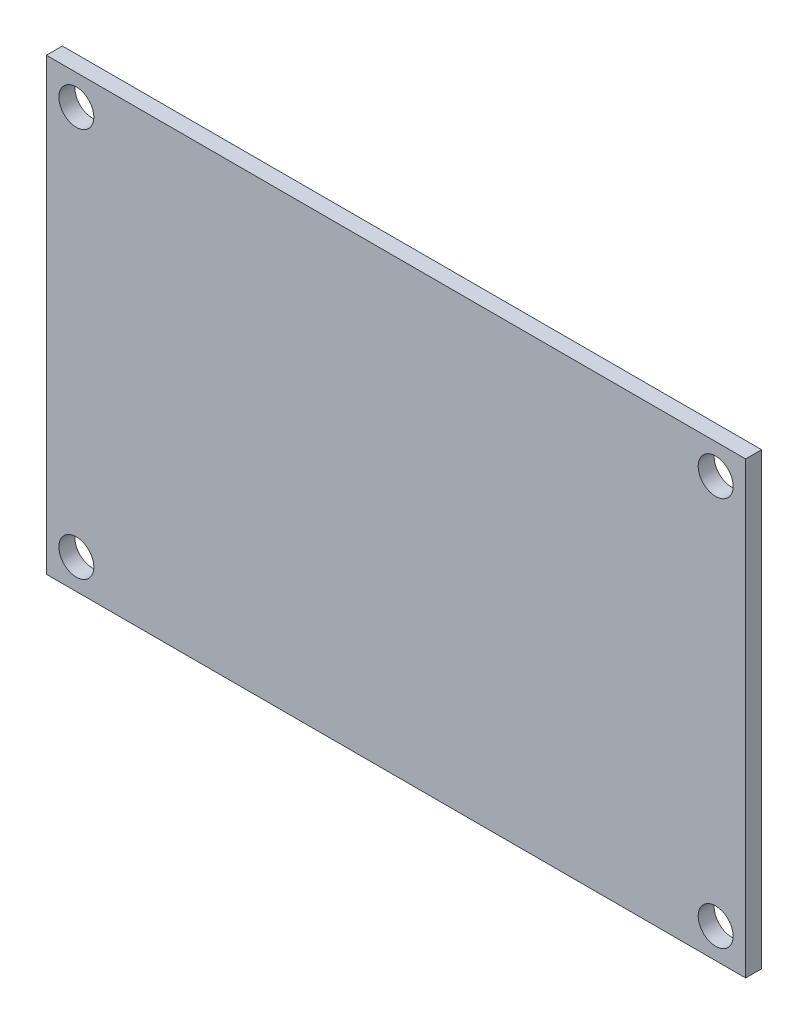
ISO-10303-21;
HEADER;
FILE_DESCRIPTION(('STEP AP214'),'2;1');
FILE_NAME('part.step','',(''),(''),'','','');
FILE_SCHEMA(('AUTOMOTIVE_DESIGN { 1 0 10303 214 1 1 1 1 }'));
ENDSEC;
DATA;
#1=APPLICATION_CONTEXT('core data for automotive mechanical design processes');
#2=APPLICATION_PROTOCOL_DEFINITION('international standard','automotive_design',2000,#1);
#3=PRODUCT_CONTEXT('',#1,'mechanical');
#4=PRODUCT('Part','Part','',(#3));
#5=PRODUCT_RELATED_PRODUCT_CATEGORY('part','',(#4));
#6=PRODUCT_DEFINITION_FORMATION('','',#4);
#7=PRODUCT_DEFINITION_CONTEXT('part definition',#1,'design');
#8=PRODUCT_DEFINITION('design','',#6,#7);
#9=PRODUCT_DEFINITION_SHAPE('','',#8);
#10=(LENGTH_UNIT() NAMED_UNIT(*) SI_UNIT(.MILLI.,.METRE.));
#11=(NAMED_UNIT(*) PLANE_ANGLE_UNIT() SI_UNIT($,.RADIAN.));
#12=(NAMED_UNIT(*) SI_UNIT($,.STERADIAN.) SOLID_ANGLE_UNIT());
#13=UNCERTAINTY_MEASURE_WITH_UNIT(LENGTH_MEASURE(1.E-05),#10,'distance_accuracy_value','');
#14=(GEOMETRIC_REPRESENTATION_CONTEXT(3) GLOBAL_UNCERTAINTY_ASSIGNED_CONTEXT((#13)) GLOBAL_UNIT_ASSIGNED_CONTEXT((#10,
#11,#12)) REPRESENTATION_CONTEXT('',''));
#15=CARTESIAN_POINT('',(0.,0.,0.));
#16=DIRECTION('',(0.,0.,1.));
#17=DIRECTION('',(1.,0.,0.));
#18=AXIS2_PLACEMENT_3D('',#15,#16,#17);
#19=CARTESIAN_POINT('',(0.,0.,1.6));
#20=DIRECTION('',(0.,0.,-1.));
#21=DIRECTION('',(-1.,0.,0.));
#22=AXIS2_PLACEMENT_3D('',#19,#20,#21);
#23=PLANE('',#22);
#24=CARTESIAN_POINT('',(-32.,-19.5,1.6));
#25=DIRECTION('',(0.,0.,-1.));
#26=DIRECTION('',(1.,0.,0.));
#27=AXIS2_PLACEMENT_3D('',#24,#25,#26);
#28=CIRCLE('',#27,1.75);
#29=CARTESIAN_POINT('',(-30.25,-19.5,1.6));
#30=VERTEX_POINT('',#29);
#31=EDGE_CURVE('E118',#30,#30,#28,.T.);
#32=ORIENTED_EDGE('',*,*,#31,.T.);
#33=EDGE_LOOP('',(#32));
#34=FACE_BOUND('',#33,.T.);
#35=CARTESIAN_POINT('',(-32.,19.5,1.6));
#36=DIRECTION('',(0.,0.,1.));
#37=DIRECTION('',(1.,0.,0.));
#38=AXIS2_PLACEMENT_3D('',#35,#36,#37);
#39=CIRCLE('',#38,1.75);
#40=CARTESIAN_POINT('',(-30.25,19.5,1.6));
#41=VERTEX_POINT('',#40);
#42=EDGE_CURVE('E112',#41,#41,#39,.T.);
#43=ORIENTED_EDGE('',*,*,#42,.F.);
#44=EDGE_LOOP('',(#43));
#45=FACE_BOUND('',#44,.T.);
#46=DIRECTION('',(0.,1.,0.));
#47=VECTOR('',#46,1.);
#48=CARTESIAN_POINT('',(35.,-22.5,1.6));
#49=LINE('',#48,#47);
#50=CARTESIAN_POINT('',(35.,-22.5,1.6));
#51=VERTEX_POINT('',#50);
#52=CARTESIAN_POINT('',(35.,22.5,1.6));
#53=VERTEX_POINT('',#52);
#54=EDGE_CURVE('E85',#51,#53,#49,.T.);
#55=ORIENTED_EDGE('',*,*,#54,.T.);
#56=DIRECTION('',(-1.,0.,0.));
#57=VECTOR('',#56,1.);
#58=CARTESIAN_POINT('',(-35.,22.5,1.6));
#59=LINE('',#58,#57);
#60=CARTESIAN_POINT('',(-35.,22.5,1.6));
#61=VERTEX_POINT('',#60);
#62=EDGE_CURVE('E80',#53,#61,#59,.T.);
#63=ORIENTED_EDGE('',*,*,#62,.T.);
#64=DIRECTION('',(0.,-1.,0.));
#65=VECTOR('',#64,1.);
#66=CARTESIAN_POINT('',(-35.,-22.5,1.6));
#67=LINE('',#66,#65);
#68=CARTESIAN_POINT('',(-35.,-22.5,1.6));
#69=VERTEX_POINT('',#68);
#70=EDGE_CURVE('E83',#61,#69,#67,.T.);
#71=ORIENTED_EDGE('',*,*,#70,.T.);
#72=DIRECTION('',(1.,0.,0.));
#73=VECTOR('',#72,1.);
#74=CARTESIAN_POINT('',(-35.,-22.5,1.6));
#75=LINE('',#74,#73);
#76=EDGE_CURVE('E50',#69,#51,#75,.T.);
#77=ORIENTED_EDGE('',*,*,#76,.T.);
#78=EDGE_LOOP('',(#55,#63,#71,#77));
#79=FACE_BOUND('',#78,.T.);
#80=CARTESIAN_POINT('',(32.,-19.5,1.6));
#81=DIRECTION('',(0.,0.,1.));
#82=DIRECTION('',(-1.,0.,0.));
#83=AXIS2_PLACEMENT_3D('',#80,#81,#82);
#84=CIRCLE('',#83,1.75);
#85=CARTESIAN_POINT('',(30.25,-19.5,1.6));
#86=VERTEX_POINT('',#85);
#87=EDGE_CURVE('E124',#86,#86,#84,.T.);
#88=ORIENTED_EDGE('',*,*,#87,.F.);
#89=EDGE_LOOP('',(#88));
#90=FACE_BOUND('',#89,.T.);
#91=CARTESIAN_POINT('',(32.,19.5,1.6));
#92=DIRECTION('',(0.,0.,-1.));
#93=DIRECTION('',(-1.,0.,0.));
#94=AXIS2_PLACEMENT_3D('',#91,#92,#93);
#95=CIRCLE('',#94,1.75);
#96=CARTESIAN_POINT('',(30.25,19.5,1.6));
#97=VERTEX_POINT('',#96);
#98=EDGE_CURVE('E130',#97,#97,#95,.T.);
#99=ORIENTED_EDGE('',*,*,#98,.T.);
#100=EDGE_LOOP('',(#99));
#101=FACE_BOUND('',#100,.T.);
#102=ADVANCED_FACE('F33',(#34,#45,#79,#90,#101),#23,.F.);
#103=CARTESIAN_POINT('',(0.,0.,0.));
#104=DIRECTION('',(0.,0.,-1.));
#105=DIRECTION('',(-1.,0.,0.));
#106=AXIS2_PLACEMENT_3D('',#103,#104,#105);
#107=PLANE('',#106);
#108=CARTESIAN_POINT('',(-32.,-19.5,0.));
#109=DIRECTION('',(0.,0.,-1.));
#110=DIRECTION('',(1.,0.,0.));
#111=AXIS2_PLACEMENT_3D('',#108,#109,#110);
#112=CIRCLE('',#111,1.75);
#113=CARTESIAN_POINT('',(-30.25,-19.5,0.));
#114=VERTEX_POINT('',#113);
#115=EDGE_CURVE('E115',#114,#114,#112,.T.);
#116=ORIENTED_EDGE('',*,*,#115,.F.);
#117=EDGE_LOOP('',(#116));
#118=FACE_BOUND('',#117,.T.);
#119=CARTESIAN_POINT('',(-32.,19.5,0.));
#120=DIRECTION('',(0.,0.,1.));
#121=DIRECTION('',(1.,0.,0.));
#122=AXIS2_PLACEMENT_3D('',#119,#120,#121);
#123=CIRCLE('',#122,1.75);
#124=CARTESIAN_POINT('',(-30.25,19.5,0.));
#125=VERTEX_POINT('',#124);
#126=EDGE_CURVE('E100',#125,#125,#123,.T.);
#127=ORIENTED_EDGE('',*,*,#126,.T.);
#128=EDGE_LOOP('',(#127));
#129=FACE_BOUND('',#128,.T.);
#130=DIRECTION('',(0.,1.,0.));
#131=VECTOR('',#130,1.);
#132=CARTESIAN_POINT('',(35.,-22.5,0.));
#133=LINE('',#132,#131);
#134=CARTESIAN_POINT('',(35.,-22.5,0.));
#135=VERTEX_POINT('',#134);
#136=CARTESIAN_POINT('',(35.,22.5,0.));
#137=VERTEX_POINT('',#136);
#138=EDGE_CURVE('E97',#135,#137,#133,.T.);
#139=ORIENTED_EDGE('',*,*,#138,.F.);
#140=DIRECTION('',(1.,0.,0.));
#141=VECTOR('',#140,1.);
#142=CARTESIAN_POINT('',(-35.,-22.5,0.));
#143=LINE('',#142,#141);
#144=CARTESIAN_POINT('',(-35.,-22.5,0.));
#145=VERTEX_POINT('',#144);
#146=EDGE_CURVE('E73',#145,#135,#143,.T.);
#147=ORIENTED_EDGE('',*,*,#146,.F.);
#148=DIRECTION('',(0.,-1.,0.));
#149=VECTOR('',#148,1.);
#150=CARTESIAN_POINT('',(-35.,-22.5,0.));
#151=LINE('',#150,#149);
#152=CARTESIAN_POINT('',(-35.,22.5,0.));
#153=VERTEX_POINT('',#152);
#154=EDGE_CURVE('E67',#153,#145,#151,.T.);
#155=ORIENTED_EDGE('',*,*,#154,.F.);
#156=DIRECTION('',(-1.,0.,0.));
#157=VECTOR('',#156,1.);
#158=CARTESIAN_POINT('',(-35.,22.5,0.));
#159=LINE('',#158,#157);
#160=EDGE_CURVE('E89',#137,#153,#159,.T.);
#161=ORIENTED_EDGE('',*,*,#160,.F.);
#162=EDGE_LOOP('',(#139,#147,#155,#161));
#163=FACE_BOUND('',#162,.T.);
#164=CARTESIAN_POINT('',(32.,-19.5,0.));
#165=DIRECTION('',(0.,0.,1.));
#166=DIRECTION('',(-1.,0.,0.));
#167=AXIS2_PLACEMENT_3D('',#164,#165,#166);
#168=CIRCLE('',#167,1.75);
#169=CARTESIAN_POINT('',(30.25,-19.5,0.));
#170=VERTEX_POINT('',#169);
#171=EDGE_CURVE('E121',#170,#170,#168,.T.);
#172=ORIENTED_EDGE('',*,*,#171,.T.);
#173=EDGE_LOOP('',(#172));
#174=FACE_BOUND('',#173,.T.);
#175=CARTESIAN_POINT('',(32.,19.5,0.));
#176=DIRECTION('',(0.,0.,-1.));
#177=DIRECTION('',(-1.,0.,0.));
#178=AXIS2_PLACEMENT_3D('',#175,#176,#177);
#179=CIRCLE('',#178,1.75);
#180=CARTESIAN_POINT('',(30.25,19.5,0.));
#181=VERTEX_POINT('',#180);
#182=EDGE_CURVE('E127',#181,#181,#179,.T.);
#183=ORIENTED_EDGE('',*,*,#182,.F.);
#184=EDGE_LOOP('',(#183));
#185=FACE_BOUND('',#184,.T.);
#186=ADVANCED_FACE('F108',(#118,#129,#163,#174,#185),#107,.T.);
#187=CARTESIAN_POINT('',(35.,-22.5,1.6));
#188=DIRECTION('',(-1.,0.,0.));
#189=DIRECTION('',(0.,0.,1.));
#190=AXIS2_PLACEMENT_3D('',#187,#188,#189);
#191=PLANE('',#190);
#192=ORIENTED_EDGE('',*,*,#138,.T.);
#193=DIRECTION('',(0.,0.,-1.));
#194=VECTOR('',#193,1.);
#195=CARTESIAN_POINT('',(35.,22.5,1.6));
#196=LINE('',#195,#194);
#197=EDGE_CURVE('E11',#53,#137,#196,.T.);
#198=ORIENTED_EDGE('',*,*,#197,.F.);
#199=ORIENTED_EDGE('',*,*,#54,.F.);
#200=DIRECTION('',(0.,0.,-1.));
#201=VECTOR('',#200,1.);
#202=CARTESIAN_POINT('',(35.,-22.5,1.6));
#203=LINE('',#202,#201);
#204=EDGE_CURVE('E93',#51,#135,#203,.T.);
#205=ORIENTED_EDGE('',*,*,#204,.T.);
#206=EDGE_LOOP('',(#192,#198,#199,#205));
#207=FACE_BOUND('',#206,.T.);
#208=ADVANCED_FACE('F35',(#207),#191,.F.);
#209=CARTESIAN_POINT('',(-35.,22.5,1.6));
#210=DIRECTION('',(0.,-1.,0.));
#211=DIRECTION('',(0.,0.,-1.));
#212=AXIS2_PLACEMENT_3D('',#209,#210,#211);
#213=PLANE('',#212);
#214=ORIENTED_EDGE('',*,*,#160,.T.);
#215=DIRECTION('',(0.,0.,-1.));
#216=VECTOR('',#215,1.);
#217=CARTESIAN_POINT('',(-35.,22.5,1.6));
#218=LINE('',#217,#216);
#219=EDGE_CURVE('E42',#61,#153,#218,.T.);
#220=ORIENTED_EDGE('',*,*,#219,.F.);
#221=ORIENTED_EDGE('',*,*,#62,.F.);
#222=ORIENTED_EDGE('',*,*,#197,.T.);
#223=EDGE_LOOP('',(#214,#220,#221,#222));
#224=FACE_BOUND('',#223,.T.);
#225=ADVANCED_FACE('F88',(#224),#213,.F.);
#226=CARTESIAN_POINT('',(-35.,-22.5,1.6));
#227=DIRECTION('',(1.,0.,0.));
#228=DIRECTION('',(0.,0.,-1.));
#229=AXIS2_PLACEMENT_3D('',#226,#227,#228);
#230=PLANE('',#229);
#231=ORIENTED_EDGE('',*,*,#154,.T.);
#232=DIRECTION('',(0.,0.,-1.));
#233=VECTOR('',#232,1.);
#234=CARTESIAN_POINT('',(-35.,-22.5,1.6));
#235=LINE('',#234,#233);
#236=EDGE_CURVE('E90',#69,#145,#235,.T.);
#237=ORIENTED_EDGE('',*,*,#236,.F.);
#238=ORIENTED_EDGE('',*,*,#70,.F.);
#239=ORIENTED_EDGE('',*,*,#219,.T.);
#240=EDGE_LOOP('',(#231,#237,#238,#239));
#241=FACE_BOUND('',#240,.T.);
#242=ADVANCED_FACE('F91',(#241),#230,.F.);
#243=CARTESIAN_POINT('',(-35.,-22.5,1.6));
#244=DIRECTION('',(0.,1.,0.));
#245=DIRECTION('',(0.,0.,1.));
#246=AXIS2_PLACEMENT_3D('',#243,#244,#245);
#247=PLANE('',#246);
#248=ORIENTED_EDGE('',*,*,#146,.T.);
#249=ORIENTED_EDGE('',*,*,#204,.F.);
#250=ORIENTED_EDGE('',*,*,#76,.F.);
#251=ORIENTED_EDGE('',*,*,#236,.T.);
#252=EDGE_LOOP('',(#248,#249,#250,#251));
#253=FACE_BOUND('',#252,.T.);
#254=ADVANCED_FACE('F105',(#253),#247,.F.);
#255=CARTESIAN_POINT('',(-32.,19.5,0.));
#256=DIRECTION('',(0.,0.,1.));
#257=DIRECTION('',(1.,0.,0.));
#258=AXIS2_PLACEMENT_3D('',#255,#256,#257);
#259=CYLINDRICAL_SURFACE('',#258,1.75);
#260=ORIENTED_EDGE('',*,*,#126,.F.);
#261=EDGE_LOOP('',(#260));
#262=FACE_BOUND('',#261,.T.);
#263=ORIENTED_EDGE('',*,*,#42,.T.);
#264=EDGE_LOOP('',(#263));
#265=FACE_BOUND('',#264,.T.);
#266=ADVANCED_FACE('F154',(#262,#265),#259,.F.);
#267=CARTESIAN_POINT('',(-32.,-19.5,0.));
#268=DIRECTION('',(0.,0.,1.));
#269=DIRECTION('',(1.,0.,0.));
#270=AXIS2_PLACEMENT_3D('',#267,#268,#269);
#271=CYLINDRICAL_SURFACE('',#270,1.75);
#272=ORIENTED_EDGE('',*,*,#115,.T.);
#273=EDGE_LOOP('',(#272));
#274=FACE_BOUND('',#273,.T.);
#275=ORIENTED_EDGE('',*,*,#31,.F.);
#276=EDGE_LOOP('',(#275));
#277=FACE_BOUND('',#276,.T.);
#278=ADVANCED_FACE('F175',(#274,#277),#271,.F.);
#279=CARTESIAN_POINT('',(32.,-19.5,0.));
#280=DIRECTION('',(0.,0.,1.));
#281=DIRECTION('',(1.,0.,0.));
#282=AXIS2_PLACEMENT_3D('',#279,#280,#281);
#283=CYLINDRICAL_SURFACE('',#282,1.75);
#284=ORIENTED_EDGE('',*,*,#171,.F.);
#285=EDGE_LOOP('',(#284));
#286=FACE_BOUND('',#285,.T.);
#287=ORIENTED_EDGE('',*,*,#87,.T.);
#288=EDGE_LOOP('',(#287));
#289=FACE_BOUND('',#288,.T.);
#290=ADVANCED_FACE('F182',(#286,#289),#283,.F.);
#291=CARTESIAN_POINT('',(32.,19.5,0.));
#292=DIRECTION('',(0.,0.,1.));
#293=DIRECTION('',(1.,0.,0.));
#294=AXIS2_PLACEMENT_3D('',#291,#292,#293);
#295=CYLINDRICAL_SURFACE('',#294,1.75);
#296=ORIENTED_EDGE('',*,*,#182,.T.);
#297=EDGE_LOOP('',(#296));
#298=FACE_BOUND('',#297,.T.);
#299=ORIENTED_EDGE('',*,*,#98,.F.);
#300=EDGE_LOOP('',(#299));
#301=FACE_BOUND('',#300,.T.);
#302=ADVANCED_FACE('F136',(#298,#301),#295,.F.);
#303=CLOSED_SHELL('',(#102,#186,#208,#225,#242,#254,#266,#278,#290,#302));
#304=MANIFOLD_SOLID_BREP('B2',#303);
#305=ADVANCED_BREP_SHAPE_REPRESENTATION('',(#18,#304),#14);
#306=SHAPE_DEFINITION_REPRESENTATION(#9,#305);
ENDSEC;
END-ISO-10303-21;
